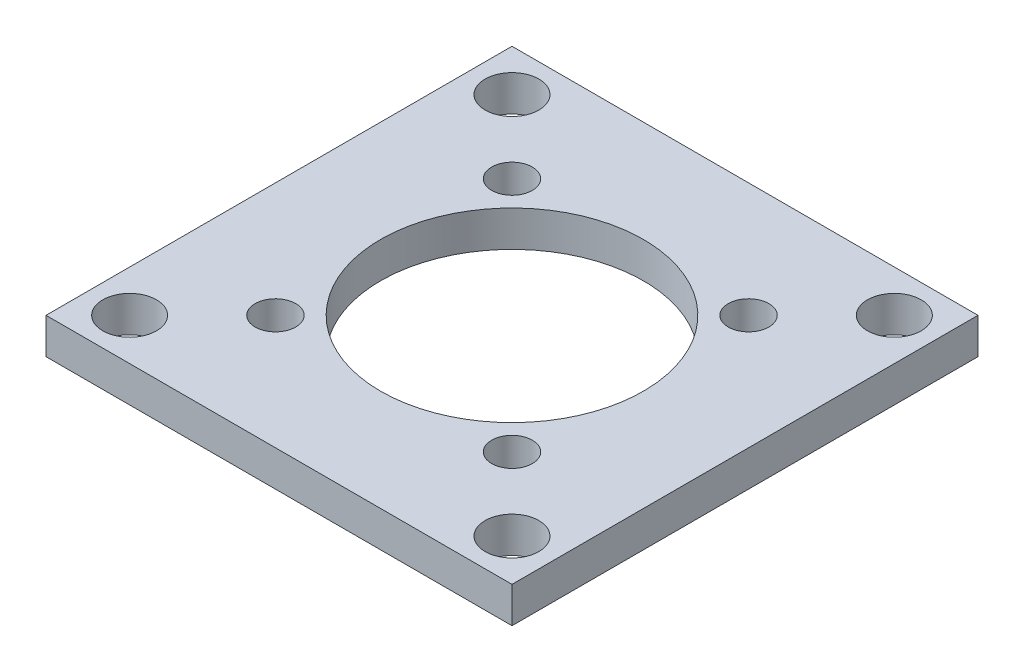
ISO-10303-21;
HEADER;
FILE_DESCRIPTION(('STEP AP214'),'2;1');
FILE_NAME('part.step','',(''),(''),'','','');
FILE_SCHEMA(('AUTOMOTIVE_DESIGN { 1 0 10303 214 1 1 1 1 }'));
ENDSEC;
DATA;
#1=APPLICATION_CONTEXT('core data for automotive mechanical design processes');
#2=APPLICATION_PROTOCOL_DEFINITION('international standard','automotive_design',2000,#1);
#3=PRODUCT_CONTEXT('',#1,'mechanical');
#4=PRODUCT('Part','Part','',(#3));
#5=PRODUCT_RELATED_PRODUCT_CATEGORY('part','',(#4));
#6=PRODUCT_DEFINITION_FORMATION('','',#4);
#7=PRODUCT_DEFINITION_CONTEXT('part definition',#1,'design');
#8=PRODUCT_DEFINITION('design','',#6,#7);
#9=PRODUCT_DEFINITION_SHAPE('','',#8);
#10=(LENGTH_UNIT() NAMED_UNIT(*) SI_UNIT(.MILLI.,.METRE.));
#11=(NAMED_UNIT(*) PLANE_ANGLE_UNIT() SI_UNIT($,.RADIAN.));
#12=(NAMED_UNIT(*) SI_UNIT($,.STERADIAN.) SOLID_ANGLE_UNIT());
#13=UNCERTAINTY_MEASURE_WITH_UNIT(LENGTH_MEASURE(1.E-05),#10,'distance_accuracy_value','');
#14=(GEOMETRIC_REPRESENTATION_CONTEXT(3) GLOBAL_UNCERTAINTY_ASSIGNED_CONTEXT((#13)) GLOBAL_UNIT_ASSIGNED_CONTEXT((#10,
#11,#12)) REPRESENTATION_CONTEXT('',''));
#15=CARTESIAN_POINT('',(0.,0.,0.));
#16=DIRECTION('',(0.,0.,1.));
#17=DIRECTION('',(1.,0.,0.));
#18=AXIS2_PLACEMENT_3D('',#15,#16,#17);
#19=CARTESIAN_POINT('',(0.,3.,0.));
#20=DIRECTION('',(0.,-1.,0.));
#21=DIRECTION('',(0.,0.,-1.));
#22=AXIS2_PLACEMENT_3D('',#19,#20,#21);
#23=PLANE('',#22);
#24=CARTESIAN_POINT('',(16.,3.,-16.));
#25=DIRECTION('',(0.,-1.,0.));
#26=DIRECTION('',(0.,0.,-1.));
#27=AXIS2_PLACEMENT_3D('',#24,#25,#26);
#28=CIRCLE('',#27,2.25);
#29=CARTESIAN_POINT('',(16.,3.,-18.25));
#30=VERTEX_POINT('',#29);
#31=EDGE_CURVE('E197',#30,#30,#28,.T.);
#32=ORIENTED_EDGE('',*,*,#31,.T.);
#33=EDGE_LOOP('',(#32));
#34=FACE_BOUND('',#33,.T.);
#35=CARTESIAN_POINT('',(16.,3.,16.));
#36=DIRECTION('',(0.,-1.,0.));
#37=DIRECTION('',(0.,0.,-1.));
#38=AXIS2_PLACEMENT_3D('',#35,#36,#37);
#39=CIRCLE('',#38,2.25);
#40=CARTESIAN_POINT('',(16.,3.,13.75));
#41=VERTEX_POINT('',#40);
#42=EDGE_CURVE('E189',#41,#41,#39,.T.);
#43=ORIENTED_EDGE('',*,*,#42,.T.);
#44=EDGE_LOOP('',(#43));
#45=FACE_BOUND('',#44,.T.);
#46=CARTESIAN_POINT('',(-16.,3.,16.));
#47=DIRECTION('',(0.,-1.,0.));
#48=DIRECTION('',(0.,0.,-1.));
#49=AXIS2_PLACEMENT_3D('',#46,#47,#48);
#50=CIRCLE('',#49,2.25);
#51=CARTESIAN_POINT('',(-16.,3.,13.75));
#52=VERTEX_POINT('',#51);
#53=EDGE_CURVE('E181',#52,#52,#50,.T.);
#54=ORIENTED_EDGE('',*,*,#53,.T.);
#55=EDGE_LOOP('',(#54));
#56=FACE_BOUND('',#55,.T.);
#57=CARTESIAN_POINT('',(-16.,3.,-16.));
#58=DIRECTION('',(0.,-1.,0.));
#59=DIRECTION('',(0.,0.,-1.));
#60=AXIS2_PLACEMENT_3D('',#57,#58,#59);
#61=CIRCLE('',#60,2.25);
#62=CARTESIAN_POINT('',(-16.,3.,-18.25));
#63=VERTEX_POINT('',#62);
#64=EDGE_CURVE('E173',#63,#63,#61,.T.);
#65=ORIENTED_EDGE('',*,*,#64,.T.);
#66=EDGE_LOOP('',(#65));
#67=FACE_BOUND('',#66,.T.);
#68=CARTESIAN_POINT('',(9.89949493661167,3.,9.89949493661167));
#69=DIRECTION('',(0.,-1.,0.));
#70=DIRECTION('',(0.,0.,-1.));
#71=AXIS2_PLACEMENT_3D('',#68,#69,#70);
#72=CIRCLE('',#71,1.7);
#73=CARTESIAN_POINT('',(9.89949493661167,3.,8.19949493661167));
#74=VERTEX_POINT('',#73);
#75=EDGE_CURVE('E165',#74,#74,#72,.T.);
#76=ORIENTED_EDGE('',*,*,#75,.T.);
#77=EDGE_LOOP('',(#76));
#78=FACE_BOUND('',#77,.T.);
#79=CARTESIAN_POINT('',(-9.89949493661167,3.,9.89949493661167));
#80=DIRECTION('',(0.,-1.,0.));
#81=DIRECTION('',(0.,0.,-1.));
#82=AXIS2_PLACEMENT_3D('',#79,#80,#81);
#83=CIRCLE('',#82,1.7);
#84=CARTESIAN_POINT('',(-9.89949493661167,3.,8.19949493661167));
#85=VERTEX_POINT('',#84);
#86=EDGE_CURVE('E157',#85,#85,#83,.T.);
#87=ORIENTED_EDGE('',*,*,#86,.T.);
#88=EDGE_LOOP('',(#87));
#89=FACE_BOUND('',#88,.T.);
#90=CARTESIAN_POINT('',(-9.89949493661167,3.,-9.89949493661167));
#91=DIRECTION('',(0.,-1.,0.));
#92=DIRECTION('',(0.,0.,-1.));
#93=AXIS2_PLACEMENT_3D('',#90,#91,#92);
#94=CIRCLE('',#93,1.7);
#95=CARTESIAN_POINT('',(-9.89949493661167,3.,-11.5994949366117));
#96=VERTEX_POINT('',#95);
#97=EDGE_CURVE('E149',#96,#96,#94,.T.);
#98=ORIENTED_EDGE('',*,*,#97,.T.);
#99=EDGE_LOOP('',(#98));
#100=FACE_BOUND('',#99,.T.);
#101=CARTESIAN_POINT('',(9.89949493661167,3.,-9.89949493661166));
#102=DIRECTION('',(0.,-1.,0.));
#103=DIRECTION('',(0.,0.,-1.));
#104=AXIS2_PLACEMENT_3D('',#101,#102,#103);
#105=CIRCLE('',#104,1.7);
#106=CARTESIAN_POINT('',(9.89949493661167,3.,-11.5994949366117));
#107=VERTEX_POINT('',#106);
#108=EDGE_CURVE('E138',#107,#107,#105,.T.);
#109=ORIENTED_EDGE('',*,*,#108,.T.);
#110=EDGE_LOOP('',(#109));
#111=FACE_BOUND('',#110,.T.);
#112=DIRECTION('',(0.,0.,-1.));
#113=VECTOR('',#112,1.);
#114=CARTESIAN_POINT('',(19.5,3.,19.5));
#115=LINE('',#114,#113);
#116=CARTESIAN_POINT('',(19.5,3.,19.5));
#117=VERTEX_POINT('',#116);
#118=CARTESIAN_POINT('',(19.5,3.,-19.5));
#119=VERTEX_POINT('',#118);
#120=EDGE_CURVE('E93',#117,#119,#115,.T.);
#121=ORIENTED_EDGE('',*,*,#120,.T.);
#122=DIRECTION('',(-1.,0.,0.));
#123=VECTOR('',#122,1.);
#124=CARTESIAN_POINT('',(-19.5,3.,-19.5));
#125=LINE('',#124,#123);
#126=CARTESIAN_POINT('',(-19.5,3.,-19.5));
#127=VERTEX_POINT('',#126);
#128=EDGE_CURVE('E88',#119,#127,#125,.T.);
#129=ORIENTED_EDGE('',*,*,#128,.T.);
#130=DIRECTION('',(0.,0.,1.));
#131=VECTOR('',#130,1.);
#132=CARTESIAN_POINT('',(-19.5,3.,19.5));
#133=LINE('',#132,#131);
#134=CARTESIAN_POINT('',(-19.5,3.,19.5));
#135=VERTEX_POINT('',#134);
#136=EDGE_CURVE('E91',#127,#135,#133,.T.);
#137=ORIENTED_EDGE('',*,*,#136,.T.);
#138=DIRECTION('',(1.,0.,0.));
#139=VECTOR('',#138,1.);
#140=CARTESIAN_POINT('',(-19.5,3.,19.5));
#141=LINE('',#140,#139);
#142=EDGE_CURVE('E58',#135,#117,#141,.T.);
#143=ORIENTED_EDGE('',*,*,#142,.T.);
#144=EDGE_LOOP('',(#121,#129,#137,#143));
#145=FACE_BOUND('',#144,.T.);
#146=CARTESIAN_POINT('',(0.,3.,0.));
#147=DIRECTION('',(0.,1.,0.));
#148=DIRECTION('',(0.,0.,1.));
#149=AXIS2_PLACEMENT_3D('',#146,#147,#148);
#150=CIRCLE('',#149,11.);
#151=CARTESIAN_POINT('',(0.,3.,11.));
#152=VERTEX_POINT('',#151);
#153=EDGE_CURVE('E114',#152,#152,#150,.T.);
#154=ORIENTED_EDGE('',*,*,#153,.F.);
#155=EDGE_LOOP('',(#154));
#156=FACE_BOUND('',#155,.T.);
#157=ADVANCED_FACE('F40',(#34,#45,#56,#67,#78,#89,#100,#111,#145,#156),#23,.F.);
#158=CARTESIAN_POINT('',(0.,0.,0.));
#159=DIRECTION('',(0.,-1.,0.));
#160=DIRECTION('',(0.,0.,-1.));
#161=AXIS2_PLACEMENT_3D('',#158,#159,#160);
#162=PLANE('',#161);
#163=CARTESIAN_POINT('',(16.,0.,-16.));
#164=DIRECTION('',(0.,-1.,0.));
#165=DIRECTION('',(0.,0.,-1.));
#166=AXIS2_PLACEMENT_3D('',#163,#164,#165);
#167=CIRCLE('',#166,2.25);
#168=CARTESIAN_POINT('',(16.,0.,-18.25));
#169=VERTEX_POINT('',#168);
#170=EDGE_CURVE('E201',#169,#169,#167,.T.);
#171=ORIENTED_EDGE('',*,*,#170,.F.);
#172=EDGE_LOOP('',(#171));
#173=FACE_BOUND('',#172,.T.);
#174=CARTESIAN_POINT('',(16.,0.,16.));
#175=DIRECTION('',(0.,-1.,0.));
#176=DIRECTION('',(0.,0.,-1.));
#177=AXIS2_PLACEMENT_3D('',#174,#175,#176);
#178=CIRCLE('',#177,2.25);
#179=CARTESIAN_POINT('',(16.,0.,13.75));
#180=VERTEX_POINT('',#179);
#181=EDGE_CURVE('E193',#180,#180,#178,.T.);
#182=ORIENTED_EDGE('',*,*,#181,.F.);
#183=EDGE_LOOP('',(#182));
#184=FACE_BOUND('',#183,.T.);
#185=CARTESIAN_POINT('',(-16.,0.,16.));
#186=DIRECTION('',(0.,-1.,0.));
#187=DIRECTION('',(0.,0.,-1.));
#188=AXIS2_PLACEMENT_3D('',#185,#186,#187);
#189=CIRCLE('',#188,2.25);
#190=CARTESIAN_POINT('',(-16.,0.,13.75));
#191=VERTEX_POINT('',#190);
#192=EDGE_CURVE('E185',#191,#191,#189,.T.);
#193=ORIENTED_EDGE('',*,*,#192,.F.);
#194=EDGE_LOOP('',(#193));
#195=FACE_BOUND('',#194,.T.);
#196=CARTESIAN_POINT('',(-16.,0.,-16.));
#197=DIRECTION('',(0.,-1.,0.));
#198=DIRECTION('',(0.,0.,-1.));
#199=AXIS2_PLACEMENT_3D('',#196,#197,#198);
#200=CIRCLE('',#199,2.25);
#201=CARTESIAN_POINT('',(-16.,0.,-18.25));
#202=VERTEX_POINT('',#201);
#203=EDGE_CURVE('E177',#202,#202,#200,.T.);
#204=ORIENTED_EDGE('',*,*,#203,.F.);
#205=EDGE_LOOP('',(#204));
#206=FACE_BOUND('',#205,.T.);
#207=CARTESIAN_POINT('',(9.89949493661167,0.,9.89949493661167));
#208=DIRECTION('',(0.,-1.,0.));
#209=DIRECTION('',(0.,0.,-1.));
#210=AXIS2_PLACEMENT_3D('',#207,#208,#209);
#211=CIRCLE('',#210,1.7);
#212=CARTESIAN_POINT('',(9.89949493661167,0.,8.19949493661166));
#213=VERTEX_POINT('',#212);
#214=EDGE_CURVE('E169',#213,#213,#211,.T.);
#215=ORIENTED_EDGE('',*,*,#214,.F.);
#216=EDGE_LOOP('',(#215));
#217=FACE_BOUND('',#216,.T.);
#218=CARTESIAN_POINT('',(-9.89949493661167,0.,9.89949493661167));
#219=DIRECTION('',(0.,-1.,0.));
#220=DIRECTION('',(0.,0.,-1.));
#221=AXIS2_PLACEMENT_3D('',#218,#219,#220);
#222=CIRCLE('',#221,1.7);
#223=CARTESIAN_POINT('',(-9.89949493661167,0.,8.19949493661166));
#224=VERTEX_POINT('',#223);
#225=EDGE_CURVE('E161',#224,#224,#222,.T.);
#226=ORIENTED_EDGE('',*,*,#225,.F.);
#227=EDGE_LOOP('',(#226));
#228=FACE_BOUND('',#227,.T.);
#229=CARTESIAN_POINT('',(-9.89949493661167,0.,-9.89949493661167));
#230=DIRECTION('',(0.,-1.,0.));
#231=DIRECTION('',(0.,0.,-1.));
#232=AXIS2_PLACEMENT_3D('',#229,#230,#231);
#233=CIRCLE('',#232,1.7);
#234=CARTESIAN_POINT('',(-9.89949493661167,0.,-11.5994949366117));
#235=VERTEX_POINT('',#234);
#236=EDGE_CURVE('E153',#235,#235,#233,.T.);
#237=ORIENTED_EDGE('',*,*,#236,.F.);
#238=EDGE_LOOP('',(#237));
#239=FACE_BOUND('',#238,.T.);
#240=CARTESIAN_POINT('',(9.89949493661167,0.,-9.89949493661166));
#241=DIRECTION('',(0.,-1.,0.));
#242=DIRECTION('',(0.,0.,-1.));
#243=AXIS2_PLACEMENT_3D('',#240,#241,#242);
#244=CIRCLE('',#243,1.7);
#245=CARTESIAN_POINT('',(9.89949493661167,0.,-11.5994949366117));
#246=VERTEX_POINT('',#245);
#247=EDGE_CURVE('E145',#246,#246,#244,.T.);
#248=ORIENTED_EDGE('',*,*,#247,.F.);
#249=EDGE_LOOP('',(#248));
#250=FACE_BOUND('',#249,.T.);
#251=DIRECTION('',(0.,0.,-1.));
#252=VECTOR('',#251,1.);
#253=CARTESIAN_POINT('',(19.5,0.,19.5));
#254=LINE('',#253,#252);
#255=CARTESIAN_POINT('',(19.5,0.,19.5));
#256=VERTEX_POINT('',#255);
#257=CARTESIAN_POINT('',(19.5,0.,-19.5));
#258=VERTEX_POINT('',#257);
#259=EDGE_CURVE('E110',#256,#258,#254,.T.);
#260=ORIENTED_EDGE('',*,*,#259,.F.);
#261=DIRECTION('',(1.,0.,0.));
#262=VECTOR('',#261,1.);
#263=CARTESIAN_POINT('',(-19.5,0.,19.5));
#264=LINE('',#263,#262);
#265=CARTESIAN_POINT('',(-19.5,0.,19.5));
#266=VERTEX_POINT('',#265);
#267=EDGE_CURVE('E81',#266,#256,#264,.T.);
#268=ORIENTED_EDGE('',*,*,#267,.F.);
#269=DIRECTION('',(0.,0.,1.));
#270=VECTOR('',#269,1.);
#271=CARTESIAN_POINT('',(-19.5,0.,19.5));
#272=LINE('',#271,#270);
#273=CARTESIAN_POINT('',(-19.5,0.,-19.5));
#274=VERTEX_POINT('',#273);
#275=EDGE_CURVE('E75',#274,#266,#272,.T.);
#276=ORIENTED_EDGE('',*,*,#275,.F.);
#277=DIRECTION('',(-1.,0.,0.));
#278=VECTOR('',#277,1.);
#279=CARTESIAN_POINT('',(-19.5,0.,-19.5));
#280=LINE('',#279,#278);
#281=EDGE_CURVE('E98',#258,#274,#280,.T.);
#282=ORIENTED_EDGE('',*,*,#281,.F.);
#283=EDGE_LOOP('',(#260,#268,#276,#282));
#284=FACE_BOUND('',#283,.T.);
#285=CARTESIAN_POINT('',(0.,0.,0.));
#286=DIRECTION('',(0.,1.,0.));
#287=DIRECTION('',(0.,0.,1.));
#288=AXIS2_PLACEMENT_3D('',#285,#286,#287);
#289=CIRCLE('',#288,11.);
#290=CARTESIAN_POINT('',(0.,0.,11.));
#291=VERTEX_POINT('',#290);
#292=EDGE_CURVE('E134',#291,#291,#289,.T.);
#293=ORIENTED_EDGE('',*,*,#292,.T.);
#294=EDGE_LOOP('',(#293));
#295=FACE_BOUND('',#294,.T.);
#296=ADVANCED_FACE('F128',(#173,#184,#195,#206,#217,#228,#239,#250,#284,#295),#162,.T.);
#297=CARTESIAN_POINT('',(19.5,3.,19.5));
#298=DIRECTION('',(-1.,0.,0.));
#299=DIRECTION('',(0.,0.,1.));
#300=AXIS2_PLACEMENT_3D('',#297,#298,#299);
#301=PLANE('',#300);
#302=ORIENTED_EDGE('',*,*,#259,.T.);
#303=DIRECTION('',(0.,-1.,0.));
#304=VECTOR('',#303,1.);
#305=CARTESIAN_POINT('',(19.5,3.,-19.5));
#306=LINE('',#305,#304);
#307=EDGE_CURVE('E11',#119,#258,#306,.T.);
#308=ORIENTED_EDGE('',*,*,#307,.F.);
#309=ORIENTED_EDGE('',*,*,#120,.F.);
#310=DIRECTION('',(0.,-1.,0.));
#311=VECTOR('',#310,1.);
#312=CARTESIAN_POINT('',(19.5,3.,19.5));
#313=LINE('',#312,#311);
#314=EDGE_CURVE('E106',#117,#256,#313,.T.);
#315=ORIENTED_EDGE('',*,*,#314,.T.);
#316=EDGE_LOOP('',(#302,#308,#309,#315));
#317=FACE_BOUND('',#316,.T.);
#318=ADVANCED_FACE('F42',(#317),#301,.F.);
#319=CARTESIAN_POINT('',(-19.5,3.,-19.5));
#320=DIRECTION('',(0.,0.,1.));
#321=DIRECTION('',(1.,0.,0.));
#322=AXIS2_PLACEMENT_3D('',#319,#320,#321);
#323=PLANE('',#322);
#324=ORIENTED_EDGE('',*,*,#281,.T.);
#325=DIRECTION('',(0.,-1.,0.));
#326=VECTOR('',#325,1.);
#327=CARTESIAN_POINT('',(-19.5,3.,-19.5));
#328=LINE('',#327,#326);
#329=EDGE_CURVE('E50',#127,#274,#328,.T.);
#330=ORIENTED_EDGE('',*,*,#329,.F.);
#331=ORIENTED_EDGE('',*,*,#128,.F.);
#332=ORIENTED_EDGE('',*,*,#307,.T.);
#333=EDGE_LOOP('',(#324,#330,#331,#332));
#334=FACE_BOUND('',#333,.T.);
#335=ADVANCED_FACE('F97',(#334),#323,.F.);
#336=CARTESIAN_POINT('',(-19.5,3.,19.5));
#337=DIRECTION('',(1.,0.,0.));
#338=DIRECTION('',(0.,0.,-1.));
#339=AXIS2_PLACEMENT_3D('',#336,#337,#338);
#340=PLANE('',#339);
#341=ORIENTED_EDGE('',*,*,#275,.T.);
#342=DIRECTION('',(0.,-1.,0.));
#343=VECTOR('',#342,1.);
#344=CARTESIAN_POINT('',(-19.5,3.,19.5));
#345=LINE('',#344,#343);
#346=EDGE_CURVE('E100',#135,#266,#345,.T.);
#347=ORIENTED_EDGE('',*,*,#346,.F.);
#348=ORIENTED_EDGE('',*,*,#136,.F.);
#349=ORIENTED_EDGE('',*,*,#329,.T.);
#350=EDGE_LOOP('',(#341,#347,#348,#349));
#351=FACE_BOUND('',#350,.T.);
#352=ADVANCED_FACE('F101',(#351),#340,.F.);
#353=CARTESIAN_POINT('',(-19.5,3.,19.5));
#354=DIRECTION('',(0.,0.,-1.));
#355=DIRECTION('',(-1.,0.,0.));
#356=AXIS2_PLACEMENT_3D('',#353,#354,#355);
#357=PLANE('',#356);
#358=ORIENTED_EDGE('',*,*,#267,.T.);
#359=ORIENTED_EDGE('',*,*,#314,.F.);
#360=ORIENTED_EDGE('',*,*,#142,.F.);
#361=ORIENTED_EDGE('',*,*,#346,.T.);
#362=EDGE_LOOP('',(#358,#359,#360,#361));
#363=FACE_BOUND('',#362,.T.);
#364=ADVANCED_FACE('F125',(#363),#357,.F.);
#365=CARTESIAN_POINT('',(0.,3.,0.));
#366=DIRECTION('',(0.,-1.,0.));
#367=DIRECTION('',(0.,0.,-1.));
#368=AXIS2_PLACEMENT_3D('',#365,#366,#367);
#369=CYLINDRICAL_SURFACE('',#368,11.);
#370=ORIENTED_EDGE('',*,*,#153,.T.);
#371=EDGE_LOOP('',(#370));
#372=FACE_BOUND('',#371,.T.);
#373=ORIENTED_EDGE('',*,*,#292,.F.);
#374=EDGE_LOOP('',(#373));
#375=FACE_BOUND('',#374,.T.);
#376=ADVANCED_FACE('F229',(#372,#375),#369,.F.);
#377=CARTESIAN_POINT('',(9.89949493661167,0.,-9.89949493661166));
#378=DIRECTION('',(0.,-1.,0.));
#379=DIRECTION('',(0.,0.,-1.));
#380=AXIS2_PLACEMENT_3D('',#377,#378,#379);
#381=CYLINDRICAL_SURFACE('',#380,1.7);
#382=ORIENTED_EDGE('',*,*,#108,.F.);
#383=EDGE_LOOP('',(#382));
#384=FACE_BOUND('',#383,.T.);
#385=ORIENTED_EDGE('',*,*,#247,.T.);
#386=EDGE_LOOP('',(#385));
#387=FACE_BOUND('',#386,.T.);
#388=ADVANCED_FACE('F226',(#384,#387),#381,.F.);
#389=CARTESIAN_POINT('',(-9.89949493661167,0.,-9.89949493661167));
#390=DIRECTION('',(0.,-1.,0.));
#391=DIRECTION('',(0.,0.,-1.));
#392=AXIS2_PLACEMENT_3D('',#389,#390,#391);
#393=CYLINDRICAL_SURFACE('',#392,1.7);
#394=ORIENTED_EDGE('',*,*,#97,.F.);
#395=EDGE_LOOP('',(#394));
#396=FACE_BOUND('',#395,.T.);
#397=ORIENTED_EDGE('',*,*,#236,.T.);
#398=EDGE_LOOP('',(#397));
#399=FACE_BOUND('',#398,.T.);
#400=ADVANCED_FACE('F228',(#396,#399),#393,.F.);
#401=CARTESIAN_POINT('',(-9.89949493661167,0.,9.89949493661167));
#402=DIRECTION('',(0.,-1.,0.));
#403=DIRECTION('',(0.,0.,-1.));
#404=AXIS2_PLACEMENT_3D('',#401,#402,#403);
#405=CYLINDRICAL_SURFACE('',#404,1.7);
#406=ORIENTED_EDGE('',*,*,#86,.F.);
#407=EDGE_LOOP('',(#406));
#408=FACE_BOUND('',#407,.T.);
#409=ORIENTED_EDGE('',*,*,#225,.T.);
#410=EDGE_LOOP('',(#409));
#411=FACE_BOUND('',#410,.T.);
#412=ADVANCED_FACE('F236',(#408,#411),#405,.F.);
#413=CARTESIAN_POINT('',(9.89949493661167,0.,9.89949493661167));
#414=DIRECTION('',(0.,-1.,0.));
#415=DIRECTION('',(0.,0.,-1.));
#416=AXIS2_PLACEMENT_3D('',#413,#414,#415);
#417=CYLINDRICAL_SURFACE('',#416,1.7);
#418=ORIENTED_EDGE('',*,*,#75,.F.);
#419=EDGE_LOOP('',(#418));
#420=FACE_BOUND('',#419,.T.);
#421=ORIENTED_EDGE('',*,*,#214,.T.);
#422=EDGE_LOOP('',(#421));
#423=FACE_BOUND('',#422,.T.);
#424=ADVANCED_FACE('F277',(#420,#423),#417,.F.);
#425=CARTESIAN_POINT('',(-16.,0.,-16.));
#426=DIRECTION('',(0.,-1.,0.));
#427=DIRECTION('',(0.,0.,-1.));
#428=AXIS2_PLACEMENT_3D('',#425,#426,#427);
#429=CYLINDRICAL_SURFACE('',#428,2.25);
#430=ORIENTED_EDGE('',*,*,#64,.F.);
#431=EDGE_LOOP('',(#430));
#432=FACE_BOUND('',#431,.T.);
#433=ORIENTED_EDGE('',*,*,#203,.T.);
#434=EDGE_LOOP('',(#433));
#435=FACE_BOUND('',#434,.T.);
#436=ADVANCED_FACE('F271',(#432,#435),#429,.F.);
#437=CARTESIAN_POINT('',(-16.,0.,16.));
#438=DIRECTION('',(0.,-1.,0.));
#439=DIRECTION('',(0.,0.,-1.));
#440=AXIS2_PLACEMENT_3D('',#437,#438,#439);
#441=CYLINDRICAL_SURFACE('',#440,2.25);
#442=ORIENTED_EDGE('',*,*,#53,.F.);
#443=EDGE_LOOP('',(#442));
#444=FACE_BOUND('',#443,.T.);
#445=ORIENTED_EDGE('',*,*,#192,.T.);
#446=EDGE_LOOP('',(#445));
#447=FACE_BOUND('',#446,.T.);
#448=ADVANCED_FACE('F276',(#444,#447),#441,.F.);
#449=CARTESIAN_POINT('',(16.,0.,16.));
#450=DIRECTION('',(0.,-1.,0.));
#451=DIRECTION('',(0.,0.,-1.));
#452=AXIS2_PLACEMENT_3D('',#449,#450,#451);
#453=CYLINDRICAL_SURFACE('',#452,2.25);
#454=ORIENTED_EDGE('',*,*,#42,.F.);
#455=EDGE_LOOP('',(#454));
#456=FACE_BOUND('',#455,.T.);
#457=ORIENTED_EDGE('',*,*,#181,.T.);
#458=EDGE_LOOP('',(#457));
#459=FACE_BOUND('',#458,.T.);
#460=ADVANCED_FACE('F290',(#456,#459),#453,.F.);
#461=CARTESIAN_POINT('',(16.,0.,-16.));
#462=DIRECTION('',(0.,-1.,0.));
#463=DIRECTION('',(0.,0.,-1.));
#464=AXIS2_PLACEMENT_3D('',#461,#462,#463);
#465=CYLINDRICAL_SURFACE('',#464,2.25);
#466=ORIENTED_EDGE('',*,*,#31,.F.);
#467=EDGE_LOOP('',(#466));
#468=FACE_BOUND('',#467,.T.);
#469=ORIENTED_EDGE('',*,*,#170,.T.);
#470=EDGE_LOOP('',(#469));
#471=FACE_BOUND('',#470,.T.);
#472=ADVANCED_FACE('F207',(#468,#471),#465,.F.);
#473=CLOSED_SHELL('',(#157,#296,#318,#335,#352,#364,#376,#388,#400,#412,#424,#436,#448,#460,#472));
#474=MANIFOLD_SOLID_BREP('B2',#473);
#475=ADVANCED_BREP_SHAPE_REPRESENTATION('',(#18,#474),#14);
#476=SHAPE_DEFINITION_REPRESENTATION(#9,#475);
ENDSEC;
END-ISO-10303-21;
